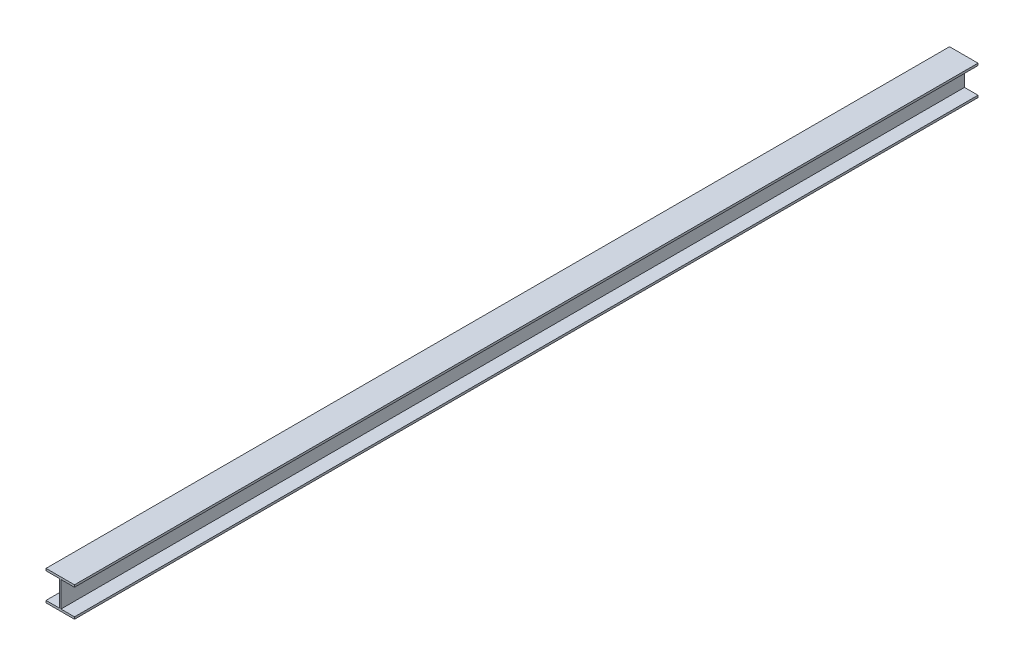
ISO-10303-21;
HEADER;
FILE_DESCRIPTION(('STEP AP214'),'2;1');
FILE_NAME('part.step','',(''),(''),'','','');
FILE_SCHEMA(('AUTOMOTIVE_DESIGN { 1 0 10303 214 1 1 1 1 }'));
ENDSEC;
DATA;
#1=APPLICATION_CONTEXT('core data for automotive mechanical design processes');
#2=APPLICATION_PROTOCOL_DEFINITION('international standard','automotive_design',2000,#1);
#3=PRODUCT_CONTEXT('',#1,'mechanical');
#4=PRODUCT('Part','Part','',(#3));
#5=PRODUCT_RELATED_PRODUCT_CATEGORY('part','',(#4));
#6=PRODUCT_DEFINITION_FORMATION('','',#4);
#7=PRODUCT_DEFINITION_CONTEXT('part definition',#1,'design');
#8=PRODUCT_DEFINITION('design','',#6,#7);
#9=PRODUCT_DEFINITION_SHAPE('','',#8);
#10=(LENGTH_UNIT() NAMED_UNIT(*) SI_UNIT(.MILLI.,.METRE.));
#11=(NAMED_UNIT(*) PLANE_ANGLE_UNIT() SI_UNIT($,.RADIAN.));
#12=(NAMED_UNIT(*) SI_UNIT($,.STERADIAN.) SOLID_ANGLE_UNIT());
#13=UNCERTAINTY_MEASURE_WITH_UNIT(LENGTH_MEASURE(1.E-05),#10,'distance_accuracy_value','');
#14=(GEOMETRIC_REPRESENTATION_CONTEXT(3) GLOBAL_UNCERTAINTY_ASSIGNED_CONTEXT((#13)) GLOBAL_UNIT_ASSIGNED_CONTEXT((#10,
#11,#12)) REPRESENTATION_CONTEXT('',''));
#15=CARTESIAN_POINT('',(0.,0.,0.));
#16=DIRECTION('',(0.,0.,1.));
#17=DIRECTION('',(1.,0.,0.));
#18=AXIS2_PLACEMENT_3D('',#15,#16,#17);
#19=CARTESIAN_POINT('',(0.,-11.5572405329582,4900.));
#20=DIRECTION('',(1.,0.,0.));
#21=DIRECTION('',(0.,0.,-1.));
#22=AXIS2_PLACEMENT_3D('',#19,#20,#21);
#23=PLANE('',#22);
#24=DIRECTION('',(0.,-1.,0.));
#25=VECTOR('',#24,1.);
#26=CARTESIAN_POINT('',(0.,-11.5572405329582,0.));
#27=LINE('',#26,#25);
#28=CARTESIAN_POINT('',(0.,-0.000240532958150197,0.));
#29=VERTEX_POINT('',#28);
#30=CARTESIAN_POINT('',(0.,-11.5572405329582,0.));
#31=VERTEX_POINT('',#30);
#32=EDGE_CURVE('E153',#29,#31,#27,.T.);
#33=ORIENTED_EDGE('',*,*,#32,.T.);
#34=DIRECTION('',(0.,0.,-1.));
#35=VECTOR('',#34,1.);
#36=CARTESIAN_POINT('',(0.,-11.5572405329582,4900.));
#37=LINE('',#36,#35);
#38=CARTESIAN_POINT('',(0.,-11.5572405329582,4900.));
#39=VERTEX_POINT('',#38);
#40=EDGE_CURVE('E11',#39,#31,#37,.T.);
#41=ORIENTED_EDGE('',*,*,#40,.F.);
#42=DIRECTION('',(0.,-1.,0.));
#43=VECTOR('',#42,1.);
#44=CARTESIAN_POINT('',(0.,-11.5572405329582,4900.));
#45=LINE('',#44,#43);
#46=CARTESIAN_POINT('',(0.,-0.000240532958150197,4900.));
#47=VERTEX_POINT('',#46);
#48=EDGE_CURVE('E175',#47,#39,#45,.T.);
#49=ORIENTED_EDGE('',*,*,#48,.F.);
#50=DIRECTION('',(0.,0.,-1.));
#51=VECTOR('',#50,1.);
#52=CARTESIAN_POINT('',(0.,-0.000240532958150197,4900.));
#53=LINE('',#52,#51);
#54=EDGE_CURVE('E149',#47,#29,#53,.T.);
#55=ORIENTED_EDGE('',*,*,#54,.T.);
#56=EDGE_LOOP('',(#33,#41,#49,#55));
#57=FACE_BOUND('',#56,.T.);
#58=ADVANCED_FACE('F33',(#57),#23,.F.);
#59=CARTESIAN_POINT('',(73.152,-11.5572405329581,4900.));
#60=DIRECTION('',(0.,1.,0.));
#61=DIRECTION('',(-1.,0.,0.));
#62=AXIS2_PLACEMENT_3D('',#59,#60,#61);
#63=PLANE('',#62);
#64=DIRECTION('',(1.,0.,0.));
#65=VECTOR('',#64,1.);
#66=CARTESIAN_POINT('',(73.152,-11.5572405329581,0.));
#67=LINE('',#66,#65);
#68=CARTESIAN_POINT('',(73.152,-11.5572405329581,0.));
#69=VERTEX_POINT('',#68);
#70=EDGE_CURVE('E156',#31,#69,#67,.T.);
#71=ORIENTED_EDGE('',*,*,#70,.T.);
#72=DIRECTION('',(0.,0.,-1.));
#73=VECTOR('',#72,1.);
#74=CARTESIAN_POINT('',(73.152,-11.5572405329581,4900.));
#75=LINE('',#74,#73);
#76=CARTESIAN_POINT('',(73.152,-11.5572405329581,4900.));
#77=VERTEX_POINT('',#76);
#78=EDGE_CURVE('E41',#77,#69,#75,.T.);
#79=ORIENTED_EDGE('',*,*,#78,.F.);
#80=DIRECTION('',(1.,0.,0.));
#81=VECTOR('',#80,1.);
#82=CARTESIAN_POINT('',(73.152,-11.5572405329581,4900.));
#83=LINE('',#82,#81);
#84=EDGE_CURVE('E104',#39,#77,#83,.T.);
#85=ORIENTED_EDGE('',*,*,#84,.F.);
#86=ORIENTED_EDGE('',*,*,#40,.T.);
#87=EDGE_LOOP('',(#71,#79,#85,#86));
#88=FACE_BOUND('',#87,.T.);
#89=ADVANCED_FACE('F253',(#88),#63,.F.);
#90=CARTESIAN_POINT('',(73.152,-150.495240532958,4900.));
#91=DIRECTION('',(1.,0.,0.));
#92=DIRECTION('',(0.,0.,-1.));
#93=AXIS2_PLACEMENT_3D('',#90,#91,#92);
#94=PLANE('',#93);
#95=DIRECTION('',(0.,-1.,0.));
#96=VECTOR('',#95,1.);
#97=CARTESIAN_POINT('',(73.152,-150.495240532958,0.));
#98=LINE('',#97,#96);
#99=CARTESIAN_POINT('',(73.152,-150.495240532958,0.));
#100=VERTEX_POINT('',#99);
#101=EDGE_CURVE('E158',#69,#100,#98,.T.);
#102=ORIENTED_EDGE('',*,*,#101,.T.);
#103=DIRECTION('',(0.,0.,-1.));
#104=VECTOR('',#103,1.);
#105=CARTESIAN_POINT('',(73.152,-150.495240532958,4900.));
#106=LINE('',#105,#104);
#107=CARTESIAN_POINT('',(73.152,-150.495240532958,4900.));
#108=VERTEX_POINT('',#107);
#109=EDGE_CURVE('E194',#108,#100,#106,.T.);
#110=ORIENTED_EDGE('',*,*,#109,.F.);
#111=DIRECTION('',(0.,-1.,0.));
#112=VECTOR('',#111,1.);
#113=CARTESIAN_POINT('',(73.152,-150.495240532958,4900.));
#114=LINE('',#113,#112);
#115=EDGE_CURVE('E202',#77,#108,#114,.T.);
#116=ORIENTED_EDGE('',*,*,#115,.F.);
#117=ORIENTED_EDGE('',*,*,#78,.T.);
#118=EDGE_LOOP('',(#102,#110,#116,#117));
#119=FACE_BOUND('',#118,.T.);
#120=ADVANCED_FACE('F200',(#119),#94,.F.);
#121=CARTESIAN_POINT('',(0.,-150.495240532958,4900.));
#122=DIRECTION('',(0.,-1.,0.));
#123=DIRECTION('',(1.,0.,0.));
#124=AXIS2_PLACEMENT_3D('',#121,#122,#123);
#125=PLANE('',#124);
#126=DIRECTION('',(-1.,0.,0.));
#127=VECTOR('',#126,1.);
#128=CARTESIAN_POINT('',(0.,-150.495240532958,0.));
#129=LINE('',#128,#127);
#130=CARTESIAN_POINT('',(0.,-150.495240532958,0.));
#131=VERTEX_POINT('',#130);
#132=EDGE_CURVE('E160',#100,#131,#129,.T.);
#133=ORIENTED_EDGE('',*,*,#132,.T.);
#134=DIRECTION('',(0.,0.,-1.));
#135=VECTOR('',#134,1.);
#136=CARTESIAN_POINT('',(0.,-150.495240532958,4900.));
#137=LINE('',#136,#135);
#138=CARTESIAN_POINT('',(0.,-150.495240532958,4900.));
#139=VERTEX_POINT('',#138);
#140=EDGE_CURVE('E191',#139,#131,#137,.T.);
#141=ORIENTED_EDGE('',*,*,#140,.F.);
#142=DIRECTION('',(-1.,0.,0.));
#143=VECTOR('',#142,1.);
#144=CARTESIAN_POINT('',(0.,-150.495240532958,4900.));
#145=LINE('',#144,#143);
#146=EDGE_CURVE('E220',#108,#139,#145,.T.);
#147=ORIENTED_EDGE('',*,*,#146,.F.);
#148=ORIENTED_EDGE('',*,*,#109,.T.);
#149=EDGE_LOOP('',(#133,#141,#147,#148));
#150=FACE_BOUND('',#149,.T.);
#151=ADVANCED_FACE('F211',(#150),#125,.F.);
#152=CARTESIAN_POINT('',(0.,-162.052240532958,4900.));
#153=DIRECTION('',(1.,0.,0.));
#154=DIRECTION('',(0.,1.,0.));
#155=AXIS2_PLACEMENT_3D('',#152,#153,#154);
#156=PLANE('',#155);
#157=DIRECTION('',(0.,-1.,0.));
#158=VECTOR('',#157,1.);
#159=CARTESIAN_POINT('',(0.,-162.052240532958,0.));
#160=LINE('',#159,#158);
#161=CARTESIAN_POINT('',(0.,-162.052240532958,0.));
#162=VERTEX_POINT('',#161);
#163=EDGE_CURVE('E162',#131,#162,#160,.T.);
#164=ORIENTED_EDGE('',*,*,#163,.T.);
#165=DIRECTION('',(0.,0.,-1.));
#166=VECTOR('',#165,1.);
#167=CARTESIAN_POINT('',(0.,-162.052240532958,4900.));
#168=LINE('',#167,#166);
#169=CARTESIAN_POINT('',(0.,-162.052240532958,4900.));
#170=VERTEX_POINT('',#169);
#171=EDGE_CURVE('E188',#170,#162,#168,.T.);
#172=ORIENTED_EDGE('',*,*,#171,.F.);
#173=DIRECTION('',(0.,-1.,0.));
#174=VECTOR('',#173,1.);
#175=CARTESIAN_POINT('',(0.,-162.052240532958,4900.));
#176=LINE('',#175,#174);
#177=EDGE_CURVE('E217',#139,#170,#176,.T.);
#178=ORIENTED_EDGE('',*,*,#177,.F.);
#179=ORIENTED_EDGE('',*,*,#140,.T.);
#180=EDGE_LOOP('',(#164,#172,#178,#179));
#181=FACE_BOUND('',#180,.T.);
#182=ADVANCED_FACE('F215',(#181),#156,.F.);
#183=CARTESIAN_POINT('',(154.432,-162.052240532958,4900.));
#184=DIRECTION('',(0.,1.,0.));
#185=DIRECTION('',(-1.,0.,0.));
#186=AXIS2_PLACEMENT_3D('',#183,#184,#185);
#187=PLANE('',#186);
#188=DIRECTION('',(1.,0.,0.));
#189=VECTOR('',#188,1.);
#190=CARTESIAN_POINT('',(154.432,-162.052240532958,0.));
#191=LINE('',#190,#189);
#192=CARTESIAN_POINT('',(154.432,-162.052240532958,0.));
#193=VERTEX_POINT('',#192);
#194=EDGE_CURVE('E164',#162,#193,#191,.T.);
#195=ORIENTED_EDGE('',*,*,#194,.T.);
#196=DIRECTION('',(0.,0.,-1.));
#197=VECTOR('',#196,1.);
#198=CARTESIAN_POINT('',(154.432,-162.052240532958,4900.));
#199=LINE('',#198,#197);
#200=CARTESIAN_POINT('',(154.432,-162.052240532958,4900.));
#201=VERTEX_POINT('',#200);
#202=EDGE_CURVE('E185',#201,#193,#199,.T.);
#203=ORIENTED_EDGE('',*,*,#202,.F.);
#204=DIRECTION('',(1.,0.,0.));
#205=VECTOR('',#204,1.);
#206=CARTESIAN_POINT('',(154.432,-162.052240532958,4900.));
#207=LINE('',#206,#205);
#208=EDGE_CURVE('E219',#170,#201,#207,.T.);
#209=ORIENTED_EDGE('',*,*,#208,.F.);
#210=ORIENTED_EDGE('',*,*,#171,.T.);
#211=EDGE_LOOP('',(#195,#203,#209,#210));
#212=FACE_BOUND('',#211,.T.);
#213=ADVANCED_FACE('F266',(#212),#187,.F.);
#214=CARTESIAN_POINT('',(154.432,-150.495240532958,4900.));
#215=DIRECTION('',(-1.,0.,0.));
#216=DIRECTION('',(0.,0.,1.));
#217=AXIS2_PLACEMENT_3D('',#214,#215,#216);
#218=PLANE('',#217);
#219=DIRECTION('',(0.,1.,0.));
#220=VECTOR('',#219,1.);
#221=CARTESIAN_POINT('',(154.432,-150.495240532958,0.));
#222=LINE('',#221,#220);
#223=CARTESIAN_POINT('',(154.432,-150.495240532958,0.));
#224=VERTEX_POINT('',#223);
#225=EDGE_CURVE('E166',#193,#224,#222,.T.);
#226=ORIENTED_EDGE('',*,*,#225,.T.);
#227=DIRECTION('',(0.,0.,-1.));
#228=VECTOR('',#227,1.);
#229=CARTESIAN_POINT('',(154.432,-150.495240532958,4900.));
#230=LINE('',#229,#228);
#231=CARTESIAN_POINT('',(154.432,-150.495240532958,4900.));
#232=VERTEX_POINT('',#231);
#233=EDGE_CURVE('E182',#232,#224,#230,.T.);
#234=ORIENTED_EDGE('',*,*,#233,.F.);
#235=DIRECTION('',(0.,1.,0.));
#236=VECTOR('',#235,1.);
#237=CARTESIAN_POINT('',(154.432,-150.495240532958,4900.));
#238=LINE('',#237,#236);
#239=EDGE_CURVE('E222',#201,#232,#238,.T.);
#240=ORIENTED_EDGE('',*,*,#239,.F.);
#241=ORIENTED_EDGE('',*,*,#202,.T.);
#242=EDGE_LOOP('',(#226,#234,#240,#241));
#243=FACE_BOUND('',#242,.T.);
#244=ADVANCED_FACE('F269',(#243),#218,.F.);
#245=CARTESIAN_POINT('',(81.28,-150.495240532958,4900.));
#246=DIRECTION('',(0.,-1.,0.));
#247=DIRECTION('',(1.,0.,0.));
#248=AXIS2_PLACEMENT_3D('',#245,#246,#247);
#249=PLANE('',#248);
#250=DIRECTION('',(-1.,0.,0.));
#251=VECTOR('',#250,1.);
#252=CARTESIAN_POINT('',(81.28,-150.495240532958,0.));
#253=LINE('',#252,#251);
#254=CARTESIAN_POINT('',(81.28,-150.495240532958,0.));
#255=VERTEX_POINT('',#254);
#256=EDGE_CURVE('E168',#224,#255,#253,.T.);
#257=ORIENTED_EDGE('',*,*,#256,.T.);
#258=DIRECTION('',(0.,0.,-1.));
#259=VECTOR('',#258,1.);
#260=CARTESIAN_POINT('',(81.28,-150.495240532958,4900.));
#261=LINE('',#260,#259);
#262=CARTESIAN_POINT('',(81.28,-150.495240532958,4900.));
#263=VERTEX_POINT('',#262);
#264=EDGE_CURVE('E179',#263,#255,#261,.T.);
#265=ORIENTED_EDGE('',*,*,#264,.F.);
#266=DIRECTION('',(-1.,0.,0.));
#267=VECTOR('',#266,1.);
#268=CARTESIAN_POINT('',(81.28,-150.495240532958,4900.));
#269=LINE('',#268,#267);
#270=EDGE_CURVE('E228',#232,#263,#269,.T.);
#271=ORIENTED_EDGE('',*,*,#270,.F.);
#272=ORIENTED_EDGE('',*,*,#233,.T.);
#273=EDGE_LOOP('',(#257,#265,#271,#272));
#274=FACE_BOUND('',#273,.T.);
#275=ADVANCED_FACE('F234',(#274),#249,.F.);
#276=CARTESIAN_POINT('',(81.28,-11.5572405329582,4900.));
#277=DIRECTION('',(-1.,0.,0.));
#278=DIRECTION('',(0.,-1.,0.));
#279=AXIS2_PLACEMENT_3D('',#276,#277,#278);
#280=PLANE('',#279);
#281=DIRECTION('',(0.,1.,0.));
#282=VECTOR('',#281,1.);
#283=CARTESIAN_POINT('',(81.28,-11.5572405329582,0.));
#284=LINE('',#283,#282);
#285=CARTESIAN_POINT('',(81.28,-11.5572405329582,0.));
#286=VERTEX_POINT('',#285);
#287=EDGE_CURVE('E170',#255,#286,#284,.T.);
#288=ORIENTED_EDGE('',*,*,#287,.T.);
#289=DIRECTION('',(0.,0.,-1.));
#290=VECTOR('',#289,1.);
#291=CARTESIAN_POINT('',(81.28,-11.5572405329582,4900.));
#292=LINE('',#291,#290);
#293=CARTESIAN_POINT('',(81.28,-11.5572405329582,4900.));
#294=VERTEX_POINT('',#293);
#295=EDGE_CURVE('E144',#294,#286,#292,.T.);
#296=ORIENTED_EDGE('',*,*,#295,.F.);
#297=DIRECTION('',(0.,1.,0.));
#298=VECTOR('',#297,1.);
#299=CARTESIAN_POINT('',(81.28,-11.5572405329582,4900.));
#300=LINE('',#299,#298);
#301=EDGE_CURVE('E135',#263,#294,#300,.T.);
#302=ORIENTED_EDGE('',*,*,#301,.F.);
#303=ORIENTED_EDGE('',*,*,#264,.T.);
#304=EDGE_LOOP('',(#288,#296,#302,#303));
#305=FACE_BOUND('',#304,.T.);
#306=ADVANCED_FACE('F238',(#305),#280,.F.);
#307=CARTESIAN_POINT('',(154.432,-11.5572405329581,4900.));
#308=DIRECTION('',(0.,1.,0.));
#309=DIRECTION('',(-1.,0.,0.));
#310=AXIS2_PLACEMENT_3D('',#307,#308,#309);
#311=PLANE('',#310);
#312=DIRECTION('',(1.,0.,0.));
#313=VECTOR('',#312,1.);
#314=CARTESIAN_POINT('',(154.432,-11.5572405329581,0.));
#315=LINE('',#314,#313);
#316=CARTESIAN_POINT('',(154.432,-11.5572405329581,0.));
#317=VERTEX_POINT('',#316);
#318=EDGE_CURVE('E143',#286,#317,#315,.T.);
#319=ORIENTED_EDGE('',*,*,#318,.T.);
#320=DIRECTION('',(0.,0.,-1.));
#321=VECTOR('',#320,1.);
#322=CARTESIAN_POINT('',(154.432,-11.5572405329581,4900.));
#323=LINE('',#322,#321);
#324=CARTESIAN_POINT('',(154.432,-11.5572405329581,4900.));
#325=VERTEX_POINT('',#324);
#326=EDGE_CURVE('E140',#325,#317,#323,.T.);
#327=ORIENTED_EDGE('',*,*,#326,.F.);
#328=DIRECTION('',(1.,0.,0.));
#329=VECTOR('',#328,1.);
#330=CARTESIAN_POINT('',(154.432,-11.5572405329581,4900.));
#331=LINE('',#330,#329);
#332=EDGE_CURVE('E129',#294,#325,#331,.T.);
#333=ORIENTED_EDGE('',*,*,#332,.F.);
#334=ORIENTED_EDGE('',*,*,#295,.T.);
#335=EDGE_LOOP('',(#319,#327,#333,#334));
#336=FACE_BOUND('',#335,.T.);
#337=ADVANCED_FACE('F141',(#336),#311,.F.);
#338=CARTESIAN_POINT('',(154.432,-0.000240532958131285,4900.));
#339=DIRECTION('',(-1.,0.,0.));
#340=DIRECTION('',(0.,0.,1.));
#341=AXIS2_PLACEMENT_3D('',#338,#339,#340);
#342=PLANE('',#341);
#343=DIRECTION('',(0.,1.,0.));
#344=VECTOR('',#343,1.);
#345=CARTESIAN_POINT('',(154.432,-0.000240532958131285,0.));
#346=LINE('',#345,#344);
#347=CARTESIAN_POINT('',(154.432,-0.000240532958131285,0.));
#348=VERTEX_POINT('',#347);
#349=EDGE_CURVE('E90',#317,#348,#346,.T.);
#350=ORIENTED_EDGE('',*,*,#349,.T.);
#351=DIRECTION('',(0.,0.,-1.));
#352=VECTOR('',#351,1.);
#353=CARTESIAN_POINT('',(154.432,-0.000240532958131285,4900.));
#354=LINE('',#353,#352);
#355=CARTESIAN_POINT('',(154.432,-0.000240532958131285,4900.));
#356=VERTEX_POINT('',#355);
#357=EDGE_CURVE('E145',#356,#348,#354,.T.);
#358=ORIENTED_EDGE('',*,*,#357,.F.);
#359=DIRECTION('',(0.,1.,0.));
#360=VECTOR('',#359,1.);
#361=CARTESIAN_POINT('',(154.432,-0.000240532958131285,4900.));
#362=LINE('',#361,#360);
#363=EDGE_CURVE('E133',#325,#356,#362,.T.);
#364=ORIENTED_EDGE('',*,*,#363,.F.);
#365=ORIENTED_EDGE('',*,*,#326,.T.);
#366=EDGE_LOOP('',(#350,#358,#364,#365));
#367=FACE_BOUND('',#366,.T.);
#368=ADVANCED_FACE('F147',(#367),#342,.F.);
#369=CARTESIAN_POINT('',(0.,-0.000240532958150197,4900.));
#370=DIRECTION('',(0.,-1.,0.));
#371=DIRECTION('',(1.,0.,0.));
#372=AXIS2_PLACEMENT_3D('',#369,#370,#371);
#373=PLANE('',#372);
#374=DIRECTION('',(-1.,0.,0.));
#375=VECTOR('',#374,1.);
#376=CARTESIAN_POINT('',(0.,-0.000240532958150197,0.));
#377=LINE('',#376,#375);
#378=EDGE_CURVE('E96',#348,#29,#377,.T.);
#379=ORIENTED_EDGE('',*,*,#378,.T.);
#380=ORIENTED_EDGE('',*,*,#54,.F.);
#381=DIRECTION('',(-1.,0.,0.));
#382=VECTOR('',#381,1.);
#383=CARTESIAN_POINT('',(0.,-0.000240532958150197,4900.));
#384=LINE('',#383,#382);
#385=EDGE_CURVE('E49',#356,#47,#384,.T.);
#386=ORIENTED_EDGE('',*,*,#385,.F.);
#387=ORIENTED_EDGE('',*,*,#357,.T.);
#388=EDGE_LOOP('',(#379,#380,#386,#387));
#389=FACE_BOUND('',#388,.T.);
#390=ADVANCED_FACE('F242',(#389),#373,.F.);
#391=CARTESIAN_POINT('',(0.,0.,4900.));
#392=DIRECTION('',(0.,0.,-1.));
#393=DIRECTION('',(-1.,0.,0.));
#394=AXIS2_PLACEMENT_3D('',#391,#392,#393);
#395=PLANE('',#394);
#396=ORIENTED_EDGE('',*,*,#48,.T.);
#397=ORIENTED_EDGE('',*,*,#84,.T.);
#398=ORIENTED_EDGE('',*,*,#115,.T.);
#399=ORIENTED_EDGE('',*,*,#146,.T.);
#400=ORIENTED_EDGE('',*,*,#177,.T.);
#401=ORIENTED_EDGE('',*,*,#208,.T.);
#402=ORIENTED_EDGE('',*,*,#239,.T.);
#403=ORIENTED_EDGE('',*,*,#270,.T.);
#404=ORIENTED_EDGE('',*,*,#301,.T.);
#405=ORIENTED_EDGE('',*,*,#332,.T.);
#406=ORIENTED_EDGE('',*,*,#363,.T.);
#407=ORIENTED_EDGE('',*,*,#385,.T.);
#408=EDGE_LOOP('',(#396,#397,#398,#399,#400,#401,#402,#403,#404,#405,#406,#407));
#409=FACE_BOUND('',#408,.T.);
#410=ADVANCED_FACE('F131',(#409),#395,.F.);
#411=CARTESIAN_POINT('',(0.,0.,0.));
#412=DIRECTION('',(0.,0.,-1.));
#413=DIRECTION('',(-1.,0.,0.));
#414=AXIS2_PLACEMENT_3D('',#411,#412,#413);
#415=PLANE('',#414);
#416=ORIENTED_EDGE('',*,*,#32,.F.);
#417=ORIENTED_EDGE('',*,*,#378,.F.);
#418=ORIENTED_EDGE('',*,*,#349,.F.);
#419=ORIENTED_EDGE('',*,*,#318,.F.);
#420=ORIENTED_EDGE('',*,*,#287,.F.);
#421=ORIENTED_EDGE('',*,*,#256,.F.);
#422=ORIENTED_EDGE('',*,*,#225,.F.);
#423=ORIENTED_EDGE('',*,*,#194,.F.);
#424=ORIENTED_EDGE('',*,*,#163,.F.);
#425=ORIENTED_EDGE('',*,*,#132,.F.);
#426=ORIENTED_EDGE('',*,*,#101,.F.);
#427=ORIENTED_EDGE('',*,*,#70,.F.);
#428=EDGE_LOOP('',(#416,#417,#418,#419,#420,#421,#422,#423,#424,#425,#426,#427));
#429=FACE_BOUND('',#428,.T.);
#430=ADVANCED_FACE('F206',(#429),#415,.T.);
#431=CLOSED_SHELL('',(#58,#89,#120,#151,#182,#213,#244,#275,#306,#337,#368,#390,#410,#430));
#432=MANIFOLD_SOLID_BREP('B2',#431);
#433=ADVANCED_BREP_SHAPE_REPRESENTATION('',(#18,#432),#14);
#434=SHAPE_DEFINITION_REPRESENTATION(#9,#433);
ENDSEC;
END-ISO-10303-21;
